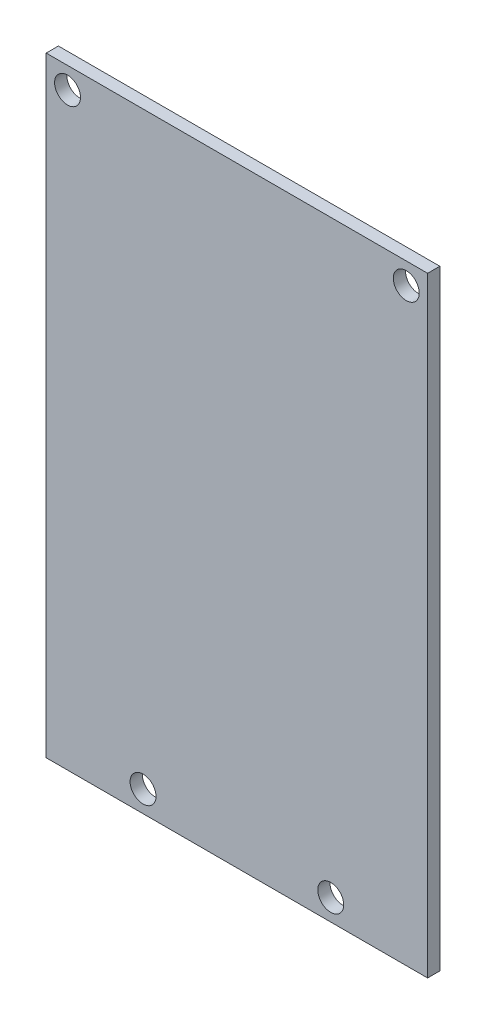
ISO-10303-21;
HEADER;
FILE_DESCRIPTION(('STEP AP214'),'2;1');
FILE_NAME('part.step','',(''),(''),'','','');
FILE_SCHEMA(('AUTOMOTIVE_DESIGN { 1 0 10303 214 1 1 1 1 }'));
ENDSEC;
DATA;
#1=APPLICATION_CONTEXT('core data for automotive mechanical design processes');
#2=APPLICATION_PROTOCOL_DEFINITION('international standard','automotive_design',2000,#1);
#3=PRODUCT_CONTEXT('',#1,'mechanical');
#4=PRODUCT('Part','Part','',(#3));
#5=PRODUCT_RELATED_PRODUCT_CATEGORY('part','',(#4));
#6=PRODUCT_DEFINITION_FORMATION('','',#4);
#7=PRODUCT_DEFINITION_CONTEXT('part definition',#1,'design');
#8=PRODUCT_DEFINITION('design','',#6,#7);
#9=PRODUCT_DEFINITION_SHAPE('','',#8);
#10=(LENGTH_UNIT() NAMED_UNIT(*) SI_UNIT(.MILLI.,.METRE.));
#11=(NAMED_UNIT(*) PLANE_ANGLE_UNIT() SI_UNIT($,.RADIAN.));
#12=(NAMED_UNIT(*) SI_UNIT($,.STERADIAN.) SOLID_ANGLE_UNIT());
#13=UNCERTAINTY_MEASURE_WITH_UNIT(LENGTH_MEASURE(1.E-05),#10,'distance_accuracy_value','');
#14=(GEOMETRIC_REPRESENTATION_CONTEXT(3) GLOBAL_UNCERTAINTY_ASSIGNED_CONTEXT((#13)) GLOBAL_UNIT_ASSIGNED_CONTEXT((#10,
#11,#12)) REPRESENTATION_CONTEXT('',''));
#15=CARTESIAN_POINT('',(0.,0.,0.));
#16=DIRECTION('',(0.,0.,1.));
#17=DIRECTION('',(1.,0.,0.));
#18=AXIS2_PLACEMENT_3D('',#15,#16,#17);
#19=CARTESIAN_POINT('',(-25.,40.,1.6));
#20=DIRECTION('',(0.,1.,0.));
#21=DIRECTION('',(0.,0.,1.));
#22=AXIS2_PLACEMENT_3D('',#19,#20,#21);
#23=PLANE('',#22);
#24=DIRECTION('',(1.,0.,0.));
#25=VECTOR('',#24,1.);
#26=CARTESIAN_POINT('',(-25.,40.,0.));
#27=LINE('',#26,#25);
#28=CARTESIAN_POINT('',(-25.,40.,0.));
#29=VERTEX_POINT('',#28);
#30=CARTESIAN_POINT('',(25.,40.,0.));
#31=VERTEX_POINT('',#30);
#32=EDGE_CURVE('E99',#29,#31,#27,.T.);
#33=ORIENTED_EDGE('',*,*,#32,.F.);
#34=DIRECTION('',(0.,0.,-1.));
#35=VECTOR('',#34,1.);
#36=CARTESIAN_POINT('',(-25.,40.,1.6));
#37=LINE('',#36,#35);
#38=CARTESIAN_POINT('',(-25.,40.,1.6));
#39=VERTEX_POINT('',#38);
#40=EDGE_CURVE('E11',#39,#29,#37,.T.);
#41=ORIENTED_EDGE('',*,*,#40,.F.);
#42=DIRECTION('',(1.,0.,0.));
#43=VECTOR('',#42,1.);
#44=CARTESIAN_POINT('',(-25.,40.,1.6));
#45=LINE('',#44,#43);
#46=CARTESIAN_POINT('',(25.,40.,1.6));
#47=VERTEX_POINT('',#46);
#48=EDGE_CURVE('E93',#39,#47,#45,.T.);
#49=ORIENTED_EDGE('',*,*,#48,.T.);
#50=DIRECTION('',(0.,0.,-1.));
#51=VECTOR('',#50,1.);
#52=CARTESIAN_POINT('',(25.,40.,1.6));
#53=LINE('',#52,#51);
#54=EDGE_CURVE('E36',#47,#31,#53,.T.);
#55=ORIENTED_EDGE('',*,*,#54,.T.);
#56=EDGE_LOOP('',(#33,#41,#49,#55));
#57=FACE_BOUND('',#56,.T.);
#58=ADVANCED_FACE('F33',(#57),#23,.T.);
#59=CARTESIAN_POINT('',(-25.,40.,1.6));
#60=DIRECTION('',(1.,0.,0.));
#61=DIRECTION('',(0.,1.,0.));
#62=AXIS2_PLACEMENT_3D('',#59,#60,#61);
#63=PLANE('',#62);
#64=DIRECTION('',(0.,-1.,0.));
#65=VECTOR('',#64,1.);
#66=CARTESIAN_POINT('',(-25.,40.,0.));
#67=LINE('',#66,#65);
#68=CARTESIAN_POINT('',(-25.,-40.,0.));
#69=VERTEX_POINT('',#68);
#70=EDGE_CURVE('E66',#29,#69,#67,.T.);
#71=ORIENTED_EDGE('',*,*,#70,.T.);
#72=DIRECTION('',(0.,0.,-1.));
#73=VECTOR('',#72,1.);
#74=CARTESIAN_POINT('',(-25.,-40.,1.6));
#75=LINE('',#74,#73);
#76=CARTESIAN_POINT('',(-25.,-40.,1.6));
#77=VERTEX_POINT('',#76);
#78=EDGE_CURVE('E42',#77,#69,#75,.T.);
#79=ORIENTED_EDGE('',*,*,#78,.F.);
#80=DIRECTION('',(0.,-1.,0.));
#81=VECTOR('',#80,1.);
#82=CARTESIAN_POINT('',(-25.,40.,1.6));
#83=LINE('',#82,#81);
#84=EDGE_CURVE('E83',#39,#77,#83,.T.);
#85=ORIENTED_EDGE('',*,*,#84,.F.);
#86=ORIENTED_EDGE('',*,*,#40,.T.);
#87=EDGE_LOOP('',(#71,#79,#85,#86));
#88=FACE_BOUND('',#87,.T.);
#89=ADVANCED_FACE('F110',(#88),#63,.F.);
#90=CARTESIAN_POINT('',(-25.,-40.,1.6));
#91=DIRECTION('',(0.,1.,0.));
#92=DIRECTION('',(0.,0.,1.));
#93=AXIS2_PLACEMENT_3D('',#90,#91,#92);
#94=PLANE('',#93);
#95=DIRECTION('',(1.,0.,0.));
#96=VECTOR('',#95,1.);
#97=CARTESIAN_POINT('',(-25.,-40.,0.));
#98=LINE('',#97,#96);
#99=CARTESIAN_POINT('',(25.,-40.,0.));
#100=VERTEX_POINT('',#99);
#101=EDGE_CURVE('E90',#69,#100,#98,.T.);
#102=ORIENTED_EDGE('',*,*,#101,.T.);
#103=DIRECTION('',(0.,0.,-1.));
#104=VECTOR('',#103,1.);
#105=CARTESIAN_POINT('',(25.,-40.,1.6));
#106=LINE('',#105,#104);
#107=CARTESIAN_POINT('',(25.,-40.,1.6));
#108=VERTEX_POINT('',#107);
#109=EDGE_CURVE('E87',#108,#100,#106,.T.);
#110=ORIENTED_EDGE('',*,*,#109,.F.);
#111=DIRECTION('',(1.,0.,0.));
#112=VECTOR('',#111,1.);
#113=CARTESIAN_POINT('',(-25.,-40.,1.6));
#114=LINE('',#113,#112);
#115=EDGE_CURVE('E78',#77,#108,#114,.T.);
#116=ORIENTED_EDGE('',*,*,#115,.F.);
#117=ORIENTED_EDGE('',*,*,#78,.T.);
#118=EDGE_LOOP('',(#102,#110,#116,#117));
#119=FACE_BOUND('',#118,.T.);
#120=ADVANCED_FACE('F88',(#119),#94,.F.);
#121=CARTESIAN_POINT('',(25.,40.,1.6));
#122=DIRECTION('',(1.,0.,0.));
#123=DIRECTION('',(0.,1.,0.));
#124=AXIS2_PLACEMENT_3D('',#121,#122,#123);
#125=PLANE('',#124);
#126=DIRECTION('',(0.,-1.,0.));
#127=VECTOR('',#126,1.);
#128=CARTESIAN_POINT('',(25.,40.,0.));
#129=LINE('',#128,#127);
#130=EDGE_CURVE('E102',#31,#100,#129,.T.);
#131=ORIENTED_EDGE('',*,*,#130,.F.);
#132=ORIENTED_EDGE('',*,*,#54,.F.);
#133=DIRECTION('',(0.,-1.,0.));
#134=VECTOR('',#133,1.);
#135=CARTESIAN_POINT('',(25.,40.,1.6));
#136=LINE('',#135,#134);
#137=EDGE_CURVE('E82',#47,#108,#136,.T.);
#138=ORIENTED_EDGE('',*,*,#137,.T.);
#139=ORIENTED_EDGE('',*,*,#109,.T.);
#140=EDGE_LOOP('',(#131,#132,#138,#139));
#141=FACE_BOUND('',#140,.T.);
#142=ADVANCED_FACE('F92',(#141),#125,.T.);
#143=CARTESIAN_POINT('',(0.,0.,1.6));
#144=DIRECTION('',(0.,0.,-1.));
#145=DIRECTION('',(-1.,0.,0.));
#146=AXIS2_PLACEMENT_3D('',#143,#144,#145);
#147=PLANE('',#146);
#148=CARTESIAN_POINT('',(-22.2,37.2,1.6));
#149=DIRECTION('',(0.,0.,1.));
#150=DIRECTION('',(1.,0.,0.));
#151=AXIS2_PLACEMENT_3D('',#148,#149,#150);
#152=CIRCLE('',#151,1.7);
#153=CARTESIAN_POINT('',(-20.5,37.2,1.6));
#154=VERTEX_POINT('',#153);
#155=EDGE_CURVE('E155',#154,#154,#152,.T.);
#156=ORIENTED_EDGE('',*,*,#155,.F.);
#157=EDGE_LOOP('',(#156));
#158=FACE_BOUND('',#157,.T.);
#159=CARTESIAN_POINT('',(22.2,37.2,1.6));
#160=DIRECTION('',(0.,0.,1.));
#161=DIRECTION('',(1.,0.,0.));
#162=AXIS2_PLACEMENT_3D('',#159,#160,#161);
#163=CIRCLE('',#162,1.7);
#164=CARTESIAN_POINT('',(23.9,37.2,1.6));
#165=VERTEX_POINT('',#164);
#166=EDGE_CURVE('E157',#165,#165,#163,.T.);
#167=ORIENTED_EDGE('',*,*,#166,.F.);
#168=EDGE_LOOP('',(#167));
#169=FACE_BOUND('',#168,.T.);
#170=CARTESIAN_POINT('',(12.3,-37.2,1.6));
#171=DIRECTION('',(0.,0.,1.));
#172=DIRECTION('',(1.,0.,0.));
#173=AXIS2_PLACEMENT_3D('',#170,#171,#172);
#174=CIRCLE('',#173,1.7);
#175=CARTESIAN_POINT('',(14.,-37.2,1.6));
#176=VERTEX_POINT('',#175);
#177=EDGE_CURVE('E165',#176,#176,#174,.T.);
#178=ORIENTED_EDGE('',*,*,#177,.F.);
#179=EDGE_LOOP('',(#178));
#180=FACE_BOUND('',#179,.T.);
#181=CARTESIAN_POINT('',(-12.3,-37.2,1.6));
#182=DIRECTION('',(0.,0.,1.));
#183=DIRECTION('',(1.,0.,0.));
#184=AXIS2_PLACEMENT_3D('',#181,#182,#183);
#185=CIRCLE('',#184,1.7);
#186=CARTESIAN_POINT('',(-10.6,-37.2,1.6));
#187=VERTEX_POINT('',#186);
#188=EDGE_CURVE('E171',#187,#187,#185,.T.);
#189=ORIENTED_EDGE('',*,*,#188,.F.);
#190=EDGE_LOOP('',(#189));
#191=FACE_BOUND('',#190,.T.);
#192=ORIENTED_EDGE('',*,*,#48,.F.);
#193=ORIENTED_EDGE('',*,*,#84,.T.);
#194=ORIENTED_EDGE('',*,*,#115,.T.);
#195=ORIENTED_EDGE('',*,*,#137,.F.);
#196=EDGE_LOOP('',(#192,#193,#194,#195));
#197=FACE_BOUND('',#196,.T.);
#198=ADVANCED_FACE('F81',(#158,#169,#180,#191,#197),#147,.F.);
#199=CARTESIAN_POINT('',(0.,0.,0.));
#200=DIRECTION('',(0.,0.,-1.));
#201=DIRECTION('',(-1.,0.,0.));
#202=AXIS2_PLACEMENT_3D('',#199,#200,#201);
#203=PLANE('',#202);
#204=CARTESIAN_POINT('',(-22.2,37.2,0.));
#205=DIRECTION('',(0.,0.,1.));
#206=DIRECTION('',(1.,0.,0.));
#207=AXIS2_PLACEMENT_3D('',#204,#205,#206);
#208=CIRCLE('',#207,1.7);
#209=CARTESIAN_POINT('',(-20.5,37.2,0.));
#210=VERTEX_POINT('',#209);
#211=EDGE_CURVE('E153',#210,#210,#208,.T.);
#212=ORIENTED_EDGE('',*,*,#211,.T.);
#213=EDGE_LOOP('',(#212));
#214=FACE_BOUND('',#213,.T.);
#215=CARTESIAN_POINT('',(22.2,37.2,0.));
#216=DIRECTION('',(0.,0.,1.));
#217=DIRECTION('',(1.,0.,0.));
#218=AXIS2_PLACEMENT_3D('',#215,#216,#217);
#219=CIRCLE('',#218,1.7);
#220=CARTESIAN_POINT('',(23.9,37.2,0.));
#221=VERTEX_POINT('',#220);
#222=EDGE_CURVE('E162',#221,#221,#219,.T.);
#223=ORIENTED_EDGE('',*,*,#222,.T.);
#224=EDGE_LOOP('',(#223));
#225=FACE_BOUND('',#224,.T.);
#226=CARTESIAN_POINT('',(12.3,-37.2,0.));
#227=DIRECTION('',(0.,0.,1.));
#228=DIRECTION('',(1.,0.,0.));
#229=AXIS2_PLACEMENT_3D('',#226,#227,#228);
#230=CIRCLE('',#229,1.7);
#231=CARTESIAN_POINT('',(14.,-37.2,0.));
#232=VERTEX_POINT('',#231);
#233=EDGE_CURVE('E168',#232,#232,#230,.T.);
#234=ORIENTED_EDGE('',*,*,#233,.T.);
#235=EDGE_LOOP('',(#234));
#236=FACE_BOUND('',#235,.T.);
#237=CARTESIAN_POINT('',(-12.3,-37.2,0.));
#238=DIRECTION('',(0.,0.,1.));
#239=DIRECTION('',(1.,0.,0.));
#240=AXIS2_PLACEMENT_3D('',#237,#238,#239);
#241=CIRCLE('',#240,1.7);
#242=CARTESIAN_POINT('',(-10.6,-37.2,0.));
#243=VERTEX_POINT('',#242);
#244=EDGE_CURVE('E103',#243,#243,#241,.T.);
#245=ORIENTED_EDGE('',*,*,#244,.T.);
#246=EDGE_LOOP('',(#245));
#247=FACE_BOUND('',#246,.T.);
#248=ORIENTED_EDGE('',*,*,#32,.T.);
#249=ORIENTED_EDGE('',*,*,#130,.T.);
#250=ORIENTED_EDGE('',*,*,#101,.F.);
#251=ORIENTED_EDGE('',*,*,#70,.F.);
#252=EDGE_LOOP('',(#248,#249,#250,#251));
#253=FACE_BOUND('',#252,.T.);
#254=ADVANCED_FACE('F108',(#214,#225,#236,#247,#253),#203,.T.);
#255=CARTESIAN_POINT('',(-12.3,-37.2,1.6));
#256=DIRECTION('',(0.,0.,1.));
#257=DIRECTION('',(1.,0.,0.));
#258=AXIS2_PLACEMENT_3D('',#255,#256,#257);
#259=CYLINDRICAL_SURFACE('',#258,1.7);
#260=ORIENTED_EDGE('',*,*,#244,.F.);
#261=EDGE_LOOP('',(#260));
#262=FACE_BOUND('',#261,.T.);
#263=ORIENTED_EDGE('',*,*,#188,.T.);
#264=EDGE_LOOP('',(#263));
#265=FACE_BOUND('',#264,.T.);
#266=ADVANCED_FACE('F129',(#262,#265),#259,.F.);
#267=CARTESIAN_POINT('',(12.3,-37.2,1.6));
#268=DIRECTION('',(0.,0.,1.));
#269=DIRECTION('',(1.,0.,0.));
#270=AXIS2_PLACEMENT_3D('',#267,#268,#269);
#271=CYLINDRICAL_SURFACE('',#270,1.7);
#272=ORIENTED_EDGE('',*,*,#233,.F.);
#273=EDGE_LOOP('',(#272));
#274=FACE_BOUND('',#273,.T.);
#275=ORIENTED_EDGE('',*,*,#177,.T.);
#276=EDGE_LOOP('',(#275));
#277=FACE_BOUND('',#276,.T.);
#278=ADVANCED_FACE('F136',(#274,#277),#271,.F.);
#279=CARTESIAN_POINT('',(22.2,37.2,1.6));
#280=DIRECTION('',(0.,0.,1.));
#281=DIRECTION('',(1.,0.,0.));
#282=AXIS2_PLACEMENT_3D('',#279,#280,#281);
#283=CYLINDRICAL_SURFACE('',#282,1.7);
#284=ORIENTED_EDGE('',*,*,#222,.F.);
#285=EDGE_LOOP('',(#284));
#286=FACE_BOUND('',#285,.T.);
#287=ORIENTED_EDGE('',*,*,#166,.T.);
#288=EDGE_LOOP('',(#287));
#289=FACE_BOUND('',#288,.T.);
#290=ADVANCED_FACE('F140',(#286,#289),#283,.F.);
#291=CARTESIAN_POINT('',(-22.2,37.2,1.6));
#292=DIRECTION('',(0.,0.,1.));
#293=DIRECTION('',(1.,0.,0.));
#294=AXIS2_PLACEMENT_3D('',#291,#292,#293);
#295=CYLINDRICAL_SURFACE('',#294,1.7);
#296=ORIENTED_EDGE('',*,*,#211,.F.);
#297=EDGE_LOOP('',(#296));
#298=FACE_BOUND('',#297,.T.);
#299=ORIENTED_EDGE('',*,*,#155,.T.);
#300=EDGE_LOOP('',(#299));
#301=FACE_BOUND('',#300,.T.);
#302=ADVANCED_FACE('F144',(#298,#301),#295,.F.);
#303=CLOSED_SHELL('',(#58,#89,#120,#142,#198,#254,#266,#278,#290,#302));
#304=MANIFOLD_SOLID_BREP('B2',#303);
#305=ADVANCED_BREP_SHAPE_REPRESENTATION('',(#18,#304),#14);
#306=SHAPE_DEFINITION_REPRESENTATION(#9,#305);
ENDSEC;
END-ISO-10303-21;
